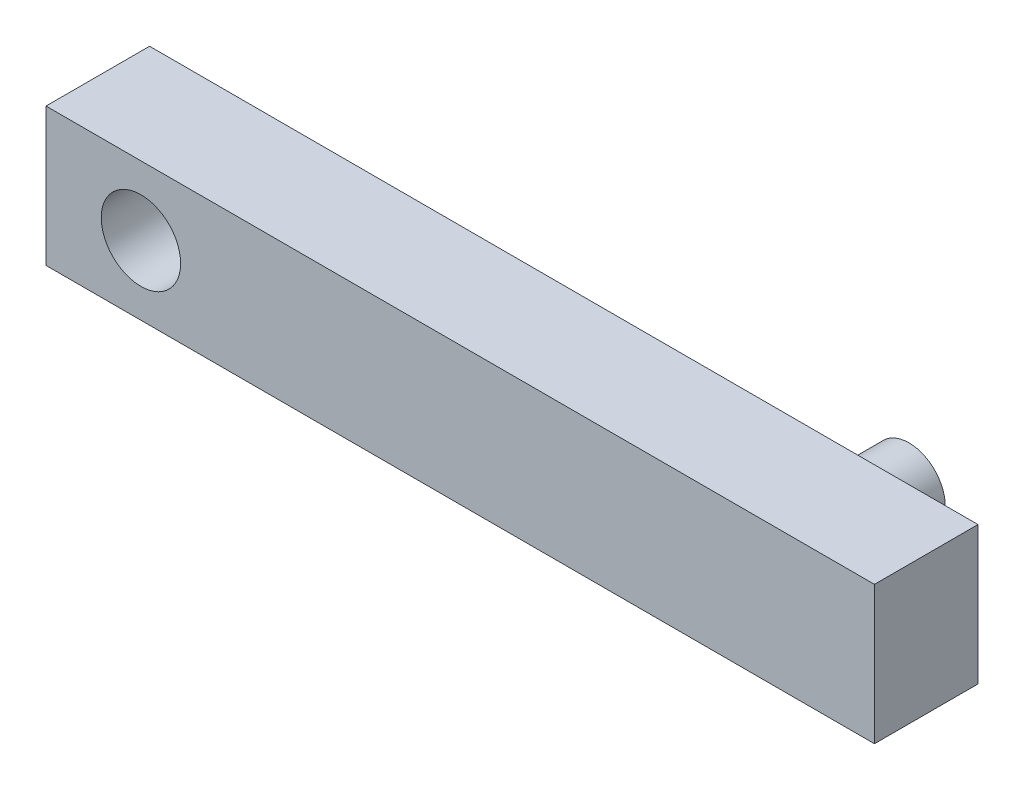
ISO-10303-21;
HEADER;
FILE_DESCRIPTION(('STEP AP214'),'2;1');
FILE_NAME('part.step','',(''),(''),'','','');
FILE_SCHEMA(('AUTOMOTIVE_DESIGN { 1 0 10303 214 1 1 1 1 }'));
ENDSEC;
DATA;
#1=APPLICATION_CONTEXT('core data for automotive mechanical design processes');
#2=APPLICATION_PROTOCOL_DEFINITION('international standard','automotive_design',2000,#1);
#3=PRODUCT_CONTEXT('',#1,'mechanical');
#4=PRODUCT('Part','Part','',(#3));
#5=PRODUCT_RELATED_PRODUCT_CATEGORY('part','',(#4));
#6=PRODUCT_DEFINITION_FORMATION('','',#4);
#7=PRODUCT_DEFINITION_CONTEXT('part definition',#1,'design');
#8=PRODUCT_DEFINITION('design','',#6,#7);
#9=PRODUCT_DEFINITION_SHAPE('','',#8);
#10=(LENGTH_UNIT() NAMED_UNIT(*) SI_UNIT(.MILLI.,.METRE.));
#11=(NAMED_UNIT(*) PLANE_ANGLE_UNIT() SI_UNIT($,.RADIAN.));
#12=(NAMED_UNIT(*) SI_UNIT($,.STERADIAN.) SOLID_ANGLE_UNIT());
#13=UNCERTAINTY_MEASURE_WITH_UNIT(LENGTH_MEASURE(1.E-05),#10,'distance_accuracy_value','');
#14=(GEOMETRIC_REPRESENTATION_CONTEXT(3) GLOBAL_UNCERTAINTY_ASSIGNED_CONTEXT((#13)) GLOBAL_UNIT_ASSIGNED_CONTEXT((#10,
#11,#12)) REPRESENTATION_CONTEXT('',''));
#15=CARTESIAN_POINT('',(0.,0.,0.));
#16=DIRECTION('',(0.,0.,1.));
#17=DIRECTION('',(1.,0.,0.));
#18=AXIS2_PLACEMENT_3D('',#15,#16,#17);
#19=CARTESIAN_POINT('',(0.,0.,3.));
#20=DIRECTION('',(1.,0.,0.));
#21=DIRECTION('',(0.,1.,0.));
#22=AXIS2_PLACEMENT_3D('',#19,#20,#21);
#23=PLANE('',#22);
#24=DIRECTION('',(0.,-1.,0.));
#25=VECTOR('',#24,1.);
#26=CARTESIAN_POINT('',(0.,0.,0.));
#27=LINE('',#26,#25);
#28=CARTESIAN_POINT('',(0.,0.,0.));
#29=VERTEX_POINT('',#28);
#30=CARTESIAN_POINT('',(0.,-4.,0.));
#31=VERTEX_POINT('',#30);
#32=EDGE_CURVE('E103',#29,#31,#27,.T.);
#33=ORIENTED_EDGE('',*,*,#32,.T.);
#34=DIRECTION('',(0.,0.,-1.));
#35=VECTOR('',#34,1.);
#36=CARTESIAN_POINT('',(0.,-4.,3.));
#37=LINE('',#36,#35);
#38=CARTESIAN_POINT('',(0.,-4.,3.));
#39=VERTEX_POINT('',#38);
#40=EDGE_CURVE('E45',#39,#31,#37,.T.);
#41=ORIENTED_EDGE('',*,*,#40,.F.);
#42=DIRECTION('',(0.,-1.,0.));
#43=VECTOR('',#42,1.);
#44=CARTESIAN_POINT('',(0.,0.,3.));
#45=LINE('',#44,#43);
#46=CARTESIAN_POINT('',(0.,0.,3.));
#47=VERTEX_POINT('',#46);
#48=EDGE_CURVE('E87',#47,#39,#45,.T.);
#49=ORIENTED_EDGE('',*,*,#48,.F.);
#50=DIRECTION('',(0.,0.,-1.));
#51=VECTOR('',#50,1.);
#52=CARTESIAN_POINT('',(0.,0.,3.));
#53=LINE('',#52,#51);
#54=EDGE_CURVE('E53',#47,#29,#53,.T.);
#55=ORIENTED_EDGE('',*,*,#54,.T.);
#56=EDGE_LOOP('',(#33,#41,#49,#55));
#57=FACE_BOUND('',#56,.T.);
#58=ADVANCED_FACE('F37',(#57),#23,.F.);
#59=CARTESIAN_POINT('',(0.,-4.,3.));
#60=DIRECTION('',(0.,1.,0.));
#61=DIRECTION('',(0.,0.,1.));
#62=AXIS2_PLACEMENT_3D('',#59,#60,#61);
#63=PLANE('',#62);
#64=DIRECTION('',(1.,0.,0.));
#65=VECTOR('',#64,1.);
#66=CARTESIAN_POINT('',(0.,-4.,0.));
#67=LINE('',#66,#65);
#68=CARTESIAN_POINT('',(24.,-4.,0.));
#69=VERTEX_POINT('',#68);
#70=EDGE_CURVE('E93',#31,#69,#67,.T.);
#71=ORIENTED_EDGE('',*,*,#70,.T.);
#72=DIRECTION('',(0.,0.,-1.));
#73=VECTOR('',#72,1.);
#74=CARTESIAN_POINT('',(24.,-4.,3.));
#75=LINE('',#74,#73);
#76=CARTESIAN_POINT('',(24.,-4.,3.));
#77=VERTEX_POINT('',#76);
#78=EDGE_CURVE('E91',#77,#69,#75,.T.);
#79=ORIENTED_EDGE('',*,*,#78,.F.);
#80=DIRECTION('',(1.,0.,0.));
#81=VECTOR('',#80,1.);
#82=CARTESIAN_POINT('',(0.,-4.,3.));
#83=LINE('',#82,#81);
#84=EDGE_CURVE('E79',#39,#77,#83,.T.);
#85=ORIENTED_EDGE('',*,*,#84,.F.);
#86=ORIENTED_EDGE('',*,*,#40,.T.);
#87=EDGE_LOOP('',(#71,#79,#85,#86));
#88=FACE_BOUND('',#87,.T.);
#89=ADVANCED_FACE('F92',(#88),#63,.F.);
#90=CARTESIAN_POINT('',(24.,0.,3.));
#91=DIRECTION('',(1.,0.,0.));
#92=DIRECTION('',(0.,0.,-1.));
#93=AXIS2_PLACEMENT_3D('',#90,#91,#92);
#94=PLANE('',#93);
#95=DIRECTION('',(0.,-1.,0.));
#96=VECTOR('',#95,1.);
#97=CARTESIAN_POINT('',(24.,0.,0.));
#98=LINE('',#97,#96);
#99=CARTESIAN_POINT('',(24.,0.,0.));
#100=VERTEX_POINT('',#99);
#101=EDGE_CURVE('E107',#100,#69,#98,.T.);
#102=ORIENTED_EDGE('',*,*,#101,.F.);
#103=DIRECTION('',(0.,0.,-1.));
#104=VECTOR('',#103,1.);
#105=CARTESIAN_POINT('',(24.,0.,3.));
#106=LINE('',#105,#104);
#107=CARTESIAN_POINT('',(24.,0.,3.));
#108=VERTEX_POINT('',#107);
#109=EDGE_CURVE('E67',#108,#100,#106,.T.);
#110=ORIENTED_EDGE('',*,*,#109,.F.);
#111=DIRECTION('',(0.,-1.,0.));
#112=VECTOR('',#111,1.);
#113=CARTESIAN_POINT('',(24.,0.,3.));
#114=LINE('',#113,#112);
#115=EDGE_CURVE('E86',#108,#77,#114,.T.);
#116=ORIENTED_EDGE('',*,*,#115,.T.);
#117=ORIENTED_EDGE('',*,*,#78,.T.);
#118=EDGE_LOOP('',(#102,#110,#116,#117));
#119=FACE_BOUND('',#118,.T.);
#120=ADVANCED_FACE('F97',(#119),#94,.T.);
#121=CARTESIAN_POINT('',(0.,0.,3.));
#122=DIRECTION('',(0.,1.,0.));
#123=DIRECTION('',(0.,0.,1.));
#124=AXIS2_PLACEMENT_3D('',#121,#122,#123);
#125=PLANE('',#124);
#126=DIRECTION('',(1.,0.,0.));
#127=VECTOR('',#126,1.);
#128=CARTESIAN_POINT('',(0.,0.,0.));
#129=LINE('',#128,#127);
#130=EDGE_CURVE('E109',#29,#100,#129,.T.);
#131=ORIENTED_EDGE('',*,*,#130,.F.);
#132=ORIENTED_EDGE('',*,*,#54,.F.);
#133=DIRECTION('',(1.,0.,0.));
#134=VECTOR('',#133,1.);
#135=CARTESIAN_POINT('',(0.,0.,3.));
#136=LINE('',#135,#134);
#137=EDGE_CURVE('E98',#47,#108,#136,.T.);
#138=ORIENTED_EDGE('',*,*,#137,.T.);
#139=ORIENTED_EDGE('',*,*,#109,.T.);
#140=EDGE_LOOP('',(#131,#132,#138,#139));
#141=FACE_BOUND('',#140,.T.);
#142=ADVANCED_FACE('F115',(#141),#125,.T.);
#143=CARTESIAN_POINT('',(0.,0.,3.));
#144=DIRECTION('',(0.,0.,1.));
#145=DIRECTION('',(1.,0.,0.));
#146=AXIS2_PLACEMENT_3D('',#143,#144,#145);
#147=PLANE('',#146);
#148=CARTESIAN_POINT('',(2.75,-2.,3.));
#149=DIRECTION('',(0.,0.,1.));
#150=DIRECTION('',(1.,0.,0.));
#151=AXIS2_PLACEMENT_3D('',#148,#149,#150);
#152=CIRCLE('',#151,1.15);
#153=CARTESIAN_POINT('',(3.9,-2.,3.));
#154=VERTEX_POINT('',#153);
#155=EDGE_CURVE('E215',#154,#154,#152,.T.);
#156=ORIENTED_EDGE('',*,*,#155,.F.);
#157=EDGE_LOOP('',(#156));
#158=FACE_BOUND('',#157,.T.);
#159=ORIENTED_EDGE('',*,*,#48,.T.);
#160=ORIENTED_EDGE('',*,*,#84,.T.);
#161=ORIENTED_EDGE('',*,*,#115,.F.);
#162=ORIENTED_EDGE('',*,*,#137,.F.);
#163=EDGE_LOOP('',(#159,#160,#161,#162));
#164=FACE_BOUND('',#163,.T.);
#165=ADVANCED_FACE('F83',(#158,#164),#147,.T.);
#166=CARTESIAN_POINT('',(0.,0.,0.));
#167=DIRECTION('',(0.,0.,1.));
#168=DIRECTION('',(1.,0.,0.));
#169=AXIS2_PLACEMENT_3D('',#166,#167,#168);
#170=PLANE('',#169);
#171=CARTESIAN_POINT('',(20.,-2.,0.));
#172=DIRECTION('',(0.,0.,1.));
#173=DIRECTION('',(1.,0.,0.));
#174=AXIS2_PLACEMENT_3D('',#171,#172,#173);
#175=CIRCLE('',#174,1.05);
#176=CARTESIAN_POINT('',(21.05,-2.,0.));
#177=VERTEX_POINT('',#176);
#178=EDGE_CURVE('E11',#177,#177,#175,.F.);
#179=ORIENTED_EDGE('',*,*,#178,.F.);
#180=EDGE_LOOP('',(#179));
#181=FACE_BOUND('',#180,.T.);
#182=CARTESIAN_POINT('',(2.75,-2.,0.));
#183=DIRECTION('',(0.,0.,1.));
#184=DIRECTION('',(1.,0.,0.));
#185=AXIS2_PLACEMENT_3D('',#182,#183,#184);
#186=CIRCLE('',#185,1.15);
#187=CARTESIAN_POINT('',(3.9,-2.,0.));
#188=VERTEX_POINT('',#187);
#189=EDGE_CURVE('E105',#188,#188,#186,.T.);
#190=ORIENTED_EDGE('',*,*,#189,.T.);
#191=EDGE_LOOP('',(#190));
#192=FACE_BOUND('',#191,.T.);
#193=ORIENTED_EDGE('',*,*,#32,.F.);
#194=ORIENTED_EDGE('',*,*,#130,.T.);
#195=ORIENTED_EDGE('',*,*,#101,.T.);
#196=ORIENTED_EDGE('',*,*,#70,.F.);
#197=EDGE_LOOP('',(#193,#194,#195,#196));
#198=FACE_BOUND('',#197,.T.);
#199=ADVANCED_FACE('F114',(#181,#192,#198),#170,.F.);
#200=CARTESIAN_POINT('',(2.75,-2.,0.));
#201=DIRECTION('',(0.,0.,1.));
#202=DIRECTION('',(1.,0.,0.));
#203=AXIS2_PLACEMENT_3D('',#200,#201,#202);
#204=CYLINDRICAL_SURFACE('',#203,1.15);
#205=ORIENTED_EDGE('',*,*,#189,.F.);
#206=EDGE_LOOP('',(#205));
#207=FACE_BOUND('',#206,.T.);
#208=ORIENTED_EDGE('',*,*,#155,.T.);
#209=EDGE_LOOP('',(#208));
#210=FACE_BOUND('',#209,.T.);
#211=ADVANCED_FACE('F156',(#207,#210),#204,.F.);
#212=CARTESIAN_POINT('',(20.,-2.,-2.));
#213=DIRECTION('',(0.,0.,1.));
#214=DIRECTION('',(1.,0.,0.));
#215=AXIS2_PLACEMENT_3D('',#212,#213,#214);
#216=CYLINDRICAL_SURFACE('',#215,1.05);
#217=CARTESIAN_POINT('',(20.,-2.,-2.));
#218=DIRECTION('',(0.,0.,-1.));
#219=DIRECTION('',(-1.,0.,0.));
#220=AXIS2_PLACEMENT_3D('',#217,#218,#219);
#221=CIRCLE('',#220,1.05);
#222=CARTESIAN_POINT('',(18.95,-2.,-2.));
#223=VERTEX_POINT('',#222);
#224=EDGE_CURVE('E214',#223,#223,#221,.T.);
#225=ORIENTED_EDGE('',*,*,#224,.F.);
#226=EDGE_LOOP('',(#225));
#227=FACE_BOUND('',#226,.T.);
#228=ORIENTED_EDGE('',*,*,#178,.T.);
#229=EDGE_LOOP('',(#228));
#230=FACE_BOUND('',#229,.T.);
#231=ADVANCED_FACE('F161',(#227,#230),#216,.T.);
#232=CARTESIAN_POINT('',(20.,-2.,-2.));
#233=DIRECTION('',(0.,0.,-1.));
#234=DIRECTION('',(-1.,0.,0.));
#235=AXIS2_PLACEMENT_3D('',#232,#233,#234);
#236=PLANE('',#235);
#237=ORIENTED_EDGE('',*,*,#224,.T.);
#238=EDGE_LOOP('',(#237));
#239=FACE_BOUND('',#238,.T.);
#240=ADVANCED_FACE('F179',(#239),#236,.T.);
#241=CLOSED_SHELL('',(#58,#89,#120,#142,#165,#199,#211,#231,#240));
#242=MANIFOLD_SOLID_BREP('B2',#241);
#243=ADVANCED_BREP_SHAPE_REPRESENTATION('',(#18,#242),#14);
#244=SHAPE_DEFINITION_REPRESENTATION(#9,#243);
ENDSEC;
END-ISO-10303-21;
